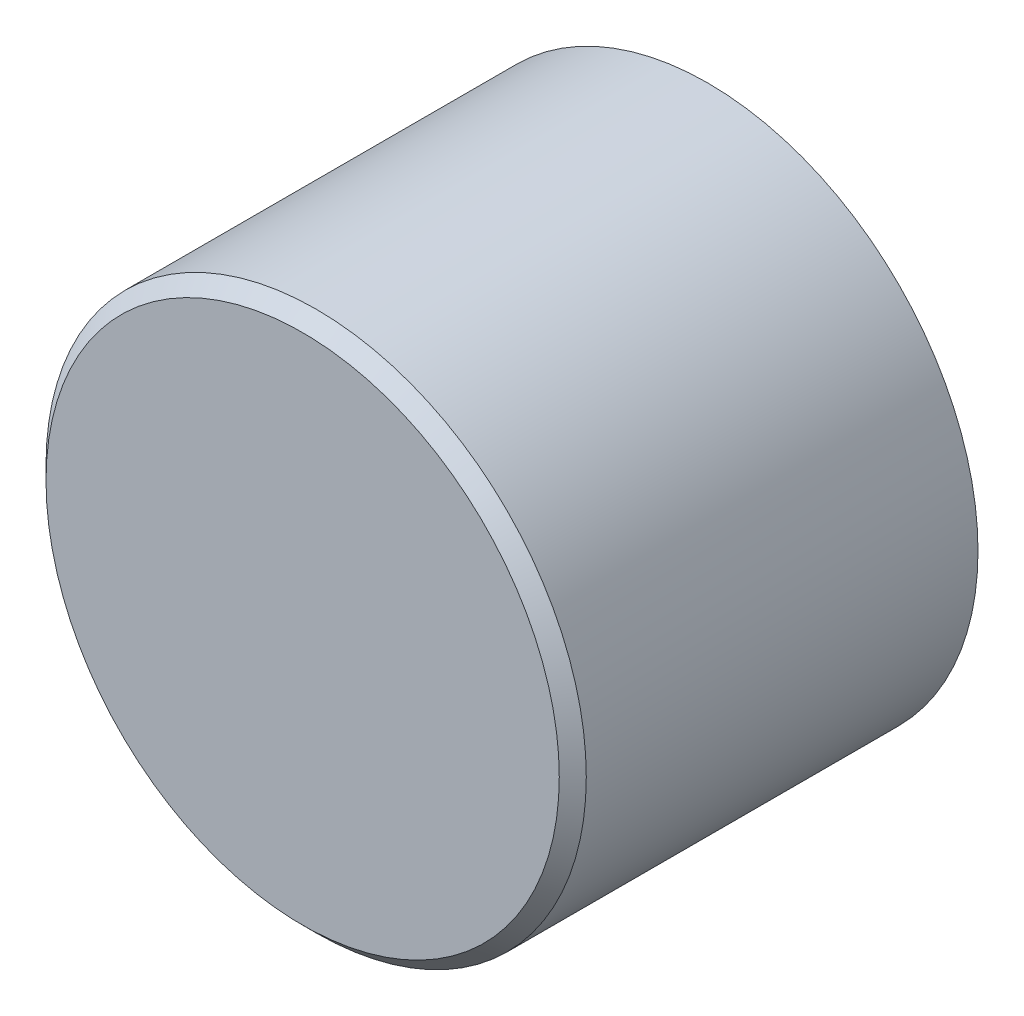
ISO-10303-21;
HEADER;
FILE_DESCRIPTION(('STEP AP214'),'2;1');
FILE_NAME('part.step','',(''),(''),'','','');
FILE_SCHEMA(('AUTOMOTIVE_DESIGN { 1 0 10303 214 1 1 1 1 }'));
ENDSEC;
DATA;
#1=APPLICATION_CONTEXT('core data for automotive mechanical design processes');
#2=APPLICATION_PROTOCOL_DEFINITION('international standard','automotive_design',2000,#1);
#3=PRODUCT_CONTEXT('',#1,'mechanical');
#4=PRODUCT('Part','Part','',(#3));
#5=PRODUCT_RELATED_PRODUCT_CATEGORY('part','',(#4));
#6=PRODUCT_DEFINITION_FORMATION('','',#4);
#7=PRODUCT_DEFINITION_CONTEXT('part definition',#1,'design');
#8=PRODUCT_DEFINITION('design','',#6,#7);
#9=PRODUCT_DEFINITION_SHAPE('','',#8);
#10=(LENGTH_UNIT() NAMED_UNIT(*) SI_UNIT(.MILLI.,.METRE.));
#11=(NAMED_UNIT(*) PLANE_ANGLE_UNIT() SI_UNIT($,.RADIAN.));
#12=(NAMED_UNIT(*) SI_UNIT($,.STERADIAN.) SOLID_ANGLE_UNIT());
#13=UNCERTAINTY_MEASURE_WITH_UNIT(LENGTH_MEASURE(1.E-05),#10,'distance_accuracy_value','');
#14=(GEOMETRIC_REPRESENTATION_CONTEXT(3) GLOBAL_UNCERTAINTY_ASSIGNED_CONTEXT((#13)) GLOBAL_UNIT_ASSIGNED_CONTEXT((#10,
#11,#12)) REPRESENTATION_CONTEXT('',''));
#15=CARTESIAN_POINT('',(0.,0.,0.));
#16=DIRECTION('',(0.,0.,1.));
#17=DIRECTION('',(1.,0.,0.));
#18=AXIS2_PLACEMENT_3D('',#15,#16,#17);
#19=CARTESIAN_POINT('',(0.,0.,3.));
#20=DIRECTION('',(0.,0.,-1.));
#21=DIRECTION('',(-1.,0.,0.));
#22=AXIS2_PLACEMENT_3D('',#19,#20,#21);
#23=CYLINDRICAL_SURFACE('',#22,2.);
#24=CARTESIAN_POINT('',(0.,0.,2.9));
#25=DIRECTION('',(0.,0.,1.));
#26=DIRECTION('',(1.,0.,0.));
#27=AXIS2_PLACEMENT_3D('',#24,#25,#26);
#28=CIRCLE('',#27,2.);
#29=CARTESIAN_POINT('',(2.,0.,2.9));
#30=VERTEX_POINT('',#29);
#31=EDGE_CURVE('E10',#30,#30,#28,.F.);
#32=ORIENTED_EDGE('',*,*,#31,.T.);
#33=EDGE_LOOP('',(#32));
#34=FACE_BOUND('',#33,.T.);
#35=CARTESIAN_POINT('',(0.,0.,0.));
#36=DIRECTION('',(0.,0.,1.));
#37=DIRECTION('',(1.,0.,0.));
#38=AXIS2_PLACEMENT_3D('',#35,#36,#37);
#39=CIRCLE('',#38,2.);
#40=CARTESIAN_POINT('',(2.,0.,0.));
#41=VERTEX_POINT('',#40);
#42=EDGE_CURVE('E42',#41,#41,#39,.T.);
#43=ORIENTED_EDGE('',*,*,#42,.T.);
#44=EDGE_LOOP('',(#43));
#45=FACE_BOUND('',#44,.T.);
#46=ADVANCED_FACE('F31',(#34,#45),#23,.T.);
#47=CARTESIAN_POINT('',(0.,0.,3.));
#48=DIRECTION('',(0.,0.,1.));
#49=DIRECTION('',(1.,0.,0.));
#50=AXIS2_PLACEMENT_3D('',#47,#48,#49);
#51=PLANE('',#50);
#52=CARTESIAN_POINT('',(0.,0.,3.));
#53=DIRECTION('',(0.,0.,1.));
#54=DIRECTION('',(1.,0.,0.));
#55=AXIS2_PLACEMENT_3D('',#52,#53,#54);
#56=CIRCLE('',#55,1.9);
#57=CARTESIAN_POINT('',(1.9,0.,3.));
#58=VERTEX_POINT('',#57);
#59=EDGE_CURVE('E38',#58,#58,#56,.T.);
#60=ORIENTED_EDGE('',*,*,#59,.T.);
#61=EDGE_LOOP('',(#60));
#62=FACE_BOUND('',#61,.T.);
#63=ADVANCED_FACE('F52',(#62),#51,.T.);
#64=CARTESIAN_POINT('',(0.,0.,0.));
#65=DIRECTION('',(0.,0.,1.));
#66=DIRECTION('',(1.,0.,0.));
#67=AXIS2_PLACEMENT_3D('',#64,#65,#66);
#68=PLANE('',#67);
#69=ORIENTED_EDGE('',*,*,#42,.F.);
#70=EDGE_LOOP('',(#69));
#71=FACE_BOUND('',#70,.T.);
#72=ADVANCED_FACE('F50',(#71),#68,.F.);
#73=CARTESIAN_POINT('',(0.,0.,3.));
#74=DIRECTION('',(0.,0.,-1.));
#75=DIRECTION('',(-1.,0.,0.));
#76=AXIS2_PLACEMENT_3D('',#73,#74,#75);
#77=CONICAL_SURFACE('',#76,1.9,0.785398163397442);
#78=ORIENTED_EDGE('',*,*,#31,.F.);
#79=EDGE_LOOP('',(#78));
#80=FACE_BOUND('',#79,.T.);
#81=ORIENTED_EDGE('',*,*,#59,.F.);
#82=EDGE_LOOP('',(#81));
#83=FACE_BOUND('',#82,.T.);
#84=ADVANCED_FACE('F33',(#80,#83),#77,.T.);
#85=CLOSED_SHELL('',(#46,#63,#72,#84));
#86=MANIFOLD_SOLID_BREP('B2',#85);
#87=ADVANCED_BREP_SHAPE_REPRESENTATION('',(#18,#86),#14);
#88=SHAPE_DEFINITION_REPRESENTATION(#9,#87);
ENDSEC;
END-ISO-10303-21;
